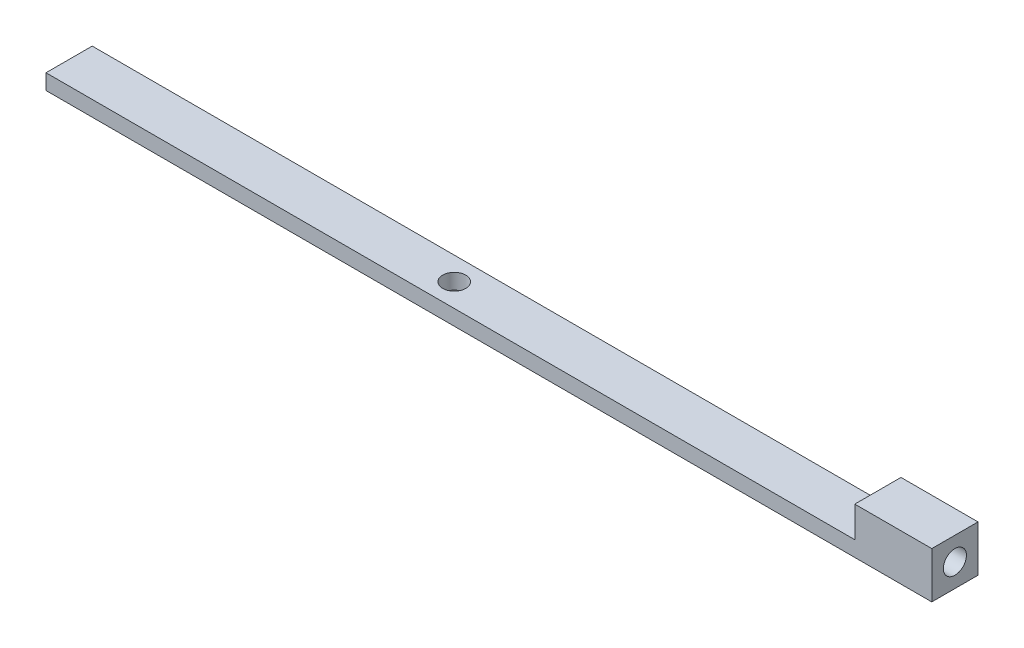
ISO-10303-21;
HEADER;
FILE_DESCRIPTION(('STEP AP214'),'2;1');
FILE_NAME('part.step','',(''),(''),'','','');
FILE_SCHEMA(('AUTOMOTIVE_DESIGN { 1 0 10303 214 1 1 1 1 }'));
ENDSEC;
DATA;
#1=APPLICATION_CONTEXT('core data for automotive mechanical design processes');
#2=APPLICATION_PROTOCOL_DEFINITION('international standard','automotive_design',2000,#1);
#3=PRODUCT_CONTEXT('',#1,'mechanical');
#4=PRODUCT('Part','Part','',(#3));
#5=PRODUCT_RELATED_PRODUCT_CATEGORY('part','',(#4));
#6=PRODUCT_DEFINITION_FORMATION('','',#4);
#7=PRODUCT_DEFINITION_CONTEXT('part definition',#1,'design');
#8=PRODUCT_DEFINITION('design','',#6,#7);
#9=PRODUCT_DEFINITION_SHAPE('','',#8);
#10=(LENGTH_UNIT() NAMED_UNIT(*) SI_UNIT(.MILLI.,.METRE.));
#11=(NAMED_UNIT(*) PLANE_ANGLE_UNIT() SI_UNIT($,.RADIAN.));
#12=(NAMED_UNIT(*) SI_UNIT($,.STERADIAN.) SOLID_ANGLE_UNIT());
#13=UNCERTAINTY_MEASURE_WITH_UNIT(LENGTH_MEASURE(1.E-05),#10,'distance_accuracy_value','');
#14=(GEOMETRIC_REPRESENTATION_CONTEXT(3) GLOBAL_UNCERTAINTY_ASSIGNED_CONTEXT((#13)) GLOBAL_UNIT_ASSIGNED_CONTEXT((#10,
#11,#12)) REPRESENTATION_CONTEXT('',''));
#15=CARTESIAN_POINT('',(0.,0.,0.));
#16=DIRECTION('',(0.,0.,1.));
#17=DIRECTION('',(1.,0.,0.));
#18=AXIS2_PLACEMENT_3D('',#15,#16,#17);
#19=CARTESIAN_POINT('',(-62.5,4.,-3.));
#20=DIRECTION('',(0.,0.,1.));
#21=DIRECTION('',(1.,0.,0.));
#22=AXIS2_PLACEMENT_3D('',#19,#20,#21);
#23=PLANE('',#22);
#24=DIRECTION('',(0.,1.,0.));
#25=VECTOR('',#24,1.);
#26=CARTESIAN_POINT('',(-42.5,0.,-3.));
#27=LINE('',#26,#25);
#28=CARTESIAN_POINT('',(-42.5,0.,-3.));
#29=VERTEX_POINT('',#28);
#30=CARTESIAN_POINT('',(-42.5,2.,-3.));
#31=VERTEX_POINT('',#30);
#32=EDGE_CURVE('E112',#29,#31,#27,.T.);
#33=ORIENTED_EDGE('',*,*,#32,.T.);
#34=DIRECTION('',(-1.,0.,0.));
#35=VECTOR('',#34,1.);
#36=CARTESIAN_POINT('',(62.5,2.,-3.));
#37=LINE('',#36,#35);
#38=CARTESIAN_POINT('',(62.5,2.,-3.));
#39=VERTEX_POINT('',#38);
#40=EDGE_CURVE('E151',#39,#31,#37,.T.);
#41=ORIENTED_EDGE('',*,*,#40,.F.);
#42=DIRECTION('',(0.,1.,0.));
#43=VECTOR('',#42,1.);
#44=CARTESIAN_POINT('',(62.5,0.,-3.));
#45=LINE('',#44,#43);
#46=CARTESIAN_POINT('',(62.5,6.,-3.));
#47=VERTEX_POINT('',#46);
#48=EDGE_CURVE('E145',#39,#47,#45,.T.);
#49=ORIENTED_EDGE('',*,*,#48,.T.);
#50=DIRECTION('',(-1.,0.,0.));
#51=VECTOR('',#50,1.);
#52=CARTESIAN_POINT('',(72.5,6.,-3.));
#53=LINE('',#52,#51);
#54=CARTESIAN_POINT('',(72.5,6.,-3.));
#55=VERTEX_POINT('',#54);
#56=EDGE_CURVE('E131',#55,#47,#53,.T.);
#57=ORIENTED_EDGE('',*,*,#56,.F.);
#58=DIRECTION('',(0.,1.,0.));
#59=VECTOR('',#58,1.);
#60=CARTESIAN_POINT('',(72.5,0.,-3.));
#61=LINE('',#60,#59);
#62=CARTESIAN_POINT('',(72.5,0.,-3.));
#63=VERTEX_POINT('',#62);
#64=EDGE_CURVE('E154',#63,#55,#61,.T.);
#65=ORIENTED_EDGE('',*,*,#64,.F.);
#66=DIRECTION('',(-1.,0.,0.));
#67=VECTOR('',#66,1.);
#68=CARTESIAN_POINT('',(-62.5,0.,-3.));
#69=LINE('',#68,#67);
#70=EDGE_CURVE('E129',#63,#29,#69,.T.);
#71=ORIENTED_EDGE('',*,*,#70,.T.);
#72=EDGE_LOOP('',(#33,#41,#49,#57,#65,#71));
#73=FACE_BOUND('',#72,.T.);
#74=ADVANCED_FACE('F47',(#73),#23,.F.);
#75=CARTESIAN_POINT('',(-62.5,4.,3.));
#76=DIRECTION('',(0.,0.,-1.));
#77=DIRECTION('',(-1.,0.,0.));
#78=AXIS2_PLACEMENT_3D('',#75,#76,#77);
#79=PLANE('',#78);
#80=DIRECTION('',(0.,1.,0.));
#81=VECTOR('',#80,1.);
#82=CARTESIAN_POINT('',(-42.5,0.,3.));
#83=LINE('',#82,#81);
#84=CARTESIAN_POINT('',(-42.5,0.,3.));
#85=VERTEX_POINT('',#84);
#86=CARTESIAN_POINT('',(-42.5,2.,3.));
#87=VERTEX_POINT('',#86);
#88=EDGE_CURVE('E62',#85,#87,#83,.T.);
#89=ORIENTED_EDGE('',*,*,#88,.F.);
#90=DIRECTION('',(1.,0.,0.));
#91=VECTOR('',#90,1.);
#92=CARTESIAN_POINT('',(-62.5,0.,3.));
#93=LINE('',#92,#91);
#94=CARTESIAN_POINT('',(72.5,0.,3.));
#95=VERTEX_POINT('',#94);
#96=EDGE_CURVE('E55',#85,#95,#93,.T.);
#97=ORIENTED_EDGE('',*,*,#96,.T.);
#98=DIRECTION('',(0.,-1.,0.));
#99=VECTOR('',#98,1.);
#100=CARTESIAN_POINT('',(72.5,0.,3.));
#101=LINE('',#100,#99);
#102=CARTESIAN_POINT('',(72.5,6.,3.));
#103=VERTEX_POINT('',#102);
#104=EDGE_CURVE('E144',#103,#95,#101,.T.);
#105=ORIENTED_EDGE('',*,*,#104,.F.);
#106=DIRECTION('',(-1.,0.,0.));
#107=VECTOR('',#106,1.);
#108=CARTESIAN_POINT('',(72.5,6.,3.));
#109=LINE('',#108,#107);
#110=CARTESIAN_POINT('',(62.5,6.,3.));
#111=VERTEX_POINT('',#110);
#112=EDGE_CURVE('E71',#103,#111,#109,.T.);
#113=ORIENTED_EDGE('',*,*,#112,.T.);
#114=DIRECTION('',(0.,-1.,0.));
#115=VECTOR('',#114,1.);
#116=CARTESIAN_POINT('',(62.5,0.,3.));
#117=LINE('',#116,#115);
#118=CARTESIAN_POINT('',(62.5,2.,3.));
#119=VERTEX_POINT('',#118);
#120=EDGE_CURVE('E148',#111,#119,#117,.T.);
#121=ORIENTED_EDGE('',*,*,#120,.T.);
#122=DIRECTION('',(1.,0.,0.));
#123=VECTOR('',#122,1.);
#124=CARTESIAN_POINT('',(62.5,2.,3.));
#125=LINE('',#124,#123);
#126=EDGE_CURVE('E120',#87,#119,#125,.T.);
#127=ORIENTED_EDGE('',*,*,#126,.F.);
#128=EDGE_LOOP('',(#89,#97,#105,#113,#121,#127));
#129=FACE_BOUND('',#128,.T.);
#130=ADVANCED_FACE('F119',(#129),#79,.F.);
#131=CARTESIAN_POINT('',(0.,0.,0.));
#132=DIRECTION('',(0.,1.,0.));
#133=DIRECTION('',(0.,0.,1.));
#134=AXIS2_PLACEMENT_3D('',#131,#132,#133);
#135=PLANE('',#134);
#136=CARTESIAN_POINT('',(7.50000000000001,0.,0.));
#137=DIRECTION('',(0.,1.,0.));
#138=DIRECTION('',(0.,0.,1.));
#139=AXIS2_PLACEMENT_3D('',#136,#137,#138);
#140=CIRCLE('',#139,1.5);
#141=CARTESIAN_POINT('',(7.50000000000001,0.,1.5));
#142=VERTEX_POINT('',#141);
#143=EDGE_CURVE('E116',#142,#142,#140,.T.);
#144=ORIENTED_EDGE('',*,*,#143,.T.);
#145=EDGE_LOOP('',(#144));
#146=FACE_BOUND('',#145,.T.);
#147=DIRECTION('',(0.,0.,1.));
#148=VECTOR('',#147,1.);
#149=CARTESIAN_POINT('',(-42.5,0.,-3.));
#150=LINE('',#149,#148);
#151=EDGE_CURVE('E109',#29,#85,#150,.T.);
#152=ORIENTED_EDGE('',*,*,#151,.F.);
#153=ORIENTED_EDGE('',*,*,#70,.F.);
#154=DIRECTION('',(0.,0.,-1.));
#155=VECTOR('',#154,1.);
#156=CARTESIAN_POINT('',(72.5,0.,0.));
#157=LINE('',#156,#155);
#158=EDGE_CURVE('E126',#95,#63,#157,.T.);
#159=ORIENTED_EDGE('',*,*,#158,.F.);
#160=ORIENTED_EDGE('',*,*,#96,.F.);
#161=EDGE_LOOP('',(#152,#153,#159,#160));
#162=FACE_BOUND('',#161,.T.);
#163=ADVANCED_FACE('F124',(#146,#162),#135,.F.);
#164=CARTESIAN_POINT('',(0.,2.,0.));
#165=DIRECTION('',(0.,-1.,0.));
#166=DIRECTION('',(0.,0.,-1.));
#167=AXIS2_PLACEMENT_3D('',#164,#165,#166);
#168=PLANE('',#167);
#169=CARTESIAN_POINT('',(7.50000000000001,2.,0.));
#170=DIRECTION('',(0.,1.,0.));
#171=DIRECTION('',(0.,0.,1.));
#172=AXIS2_PLACEMENT_3D('',#169,#170,#171);
#173=CIRCLE('',#172,1.5);
#174=CARTESIAN_POINT('',(7.50000000000001,2.,1.5));
#175=VERTEX_POINT('',#174);
#176=EDGE_CURVE('E184',#175,#175,#173,.T.);
#177=ORIENTED_EDGE('',*,*,#176,.F.);
#178=EDGE_LOOP('',(#177));
#179=FACE_BOUND('',#178,.T.);
#180=DIRECTION('',(0.,0.,1.));
#181=VECTOR('',#180,1.);
#182=CARTESIAN_POINT('',(-42.5,2.,-3.));
#183=LINE('',#182,#181);
#184=EDGE_CURVE('E122',#31,#87,#183,.T.);
#185=ORIENTED_EDGE('',*,*,#184,.T.);
#186=ORIENTED_EDGE('',*,*,#126,.T.);
#187=DIRECTION('',(0.,0.,-1.));
#188=VECTOR('',#187,1.);
#189=CARTESIAN_POINT('',(62.5,2.,-3.));
#190=LINE('',#189,#188);
#191=CARTESIAN_POINT('',(62.5,2.,1.11803398874989));
#192=VERTEX_POINT('',#191);
#193=EDGE_CURVE('E164',#119,#192,#190,.T.);
#194=ORIENTED_EDGE('',*,*,#193,.T.);
#195=DIRECTION('',(0.,0.,-1.));
#196=VECTOR('',#195,1.);
#197=CARTESIAN_POINT('',(62.5,2.,0.));
#198=LINE('',#197,#196);
#199=CARTESIAN_POINT('',(62.5,2.,-1.11803398874989));
#200=VERTEX_POINT('',#199);
#201=EDGE_CURVE('E11',#192,#200,#198,.T.);
#202=ORIENTED_EDGE('',*,*,#201,.T.);
#203=EDGE_CURVE('E168',#200,#39,#190,.T.);
#204=ORIENTED_EDGE('',*,*,#203,.T.);
#205=ORIENTED_EDGE('',*,*,#40,.T.);
#206=EDGE_LOOP('',(#185,#186,#194,#202,#204,#205));
#207=FACE_BOUND('',#206,.T.);
#208=ADVANCED_FACE('F199',(#179,#207),#168,.F.);
#209=CARTESIAN_POINT('',(72.5,6.,0.));
#210=DIRECTION('',(0.,1.,0.));
#211=DIRECTION('',(0.,0.,1.));
#212=AXIS2_PLACEMENT_3D('',#209,#210,#211);
#213=PLANE('',#212);
#214=DIRECTION('',(0.,0.,-1.));
#215=VECTOR('',#214,1.);
#216=CARTESIAN_POINT('',(62.5,6.,0.));
#217=LINE('',#216,#215);
#218=EDGE_CURVE('E140',#111,#47,#217,.T.);
#219=ORIENTED_EDGE('',*,*,#218,.F.);
#220=ORIENTED_EDGE('',*,*,#112,.F.);
#221=DIRECTION('',(0.,0.,-1.));
#222=VECTOR('',#221,1.);
#223=CARTESIAN_POINT('',(72.5,6.,0.));
#224=LINE('',#223,#222);
#225=EDGE_CURVE('E139',#103,#55,#224,.T.);
#226=ORIENTED_EDGE('',*,*,#225,.T.);
#227=ORIENTED_EDGE('',*,*,#56,.T.);
#228=EDGE_LOOP('',(#219,#220,#226,#227));
#229=FACE_BOUND('',#228,.T.);
#230=ADVANCED_FACE('F202',(#229),#213,.T.);
#231=CARTESIAN_POINT('',(72.5,0.,0.));
#232=DIRECTION('',(1.,0.,0.));
#233=DIRECTION('',(0.,0.,-1.));
#234=AXIS2_PLACEMENT_3D('',#231,#232,#233);
#235=PLANE('',#234);
#236=CARTESIAN_POINT('',(72.5,3.,0.));
#237=DIRECTION('',(1.,0.,0.));
#238=DIRECTION('',(0.,0.,-1.));
#239=AXIS2_PLACEMENT_3D('',#236,#237,#238);
#240=CIRCLE('',#239,1.5);
#241=CARTESIAN_POINT('',(72.5,3.,-1.5));
#242=VERTEX_POINT('',#241);
#243=EDGE_CURVE('E172',#242,#242,#240,.T.);
#244=ORIENTED_EDGE('',*,*,#243,.F.);
#245=EDGE_LOOP('',(#244));
#246=FACE_BOUND('',#245,.T.);
#247=ORIENTED_EDGE('',*,*,#104,.T.);
#248=ORIENTED_EDGE('',*,*,#158,.T.);
#249=ORIENTED_EDGE('',*,*,#64,.T.);
#250=ORIENTED_EDGE('',*,*,#225,.F.);
#251=EDGE_LOOP('',(#247,#248,#249,#250));
#252=FACE_BOUND('',#251,.T.);
#253=ADVANCED_FACE('F209',(#246,#252),#235,.T.);
#254=CARTESIAN_POINT('',(62.5,0.,0.));
#255=DIRECTION('',(1.,0.,0.));
#256=DIRECTION('',(0.,0.,-1.));
#257=AXIS2_PLACEMENT_3D('',#254,#255,#256);
#258=PLANE('',#257);
#259=ORIENTED_EDGE('',*,*,#203,.F.);
#260=CARTESIAN_POINT('',(62.5,3.,0.));
#261=DIRECTION('',(1.,0.,0.));
#262=DIRECTION('',(0.,0.,-1.));
#263=AXIS2_PLACEMENT_3D('',#260,#261,#262);
#264=CIRCLE('',#263,1.5);
#265=EDGE_CURVE('E176',#200,#192,#264,.T.);
#266=ORIENTED_EDGE('',*,*,#265,.T.);
#267=ORIENTED_EDGE('',*,*,#193,.F.);
#268=ORIENTED_EDGE('',*,*,#120,.F.);
#269=ORIENTED_EDGE('',*,*,#218,.T.);
#270=ORIENTED_EDGE('',*,*,#48,.F.);
#271=EDGE_LOOP('',(#259,#266,#267,#268,#269,#270));
#272=FACE_BOUND('',#271,.T.);
#273=ADVANCED_FACE('F214',(#272),#258,.F.);
#274=CARTESIAN_POINT('',(62.5,3.,0.));
#275=DIRECTION('',(1.,0.,0.));
#276=DIRECTION('',(0.,0.,-1.));
#277=AXIS2_PLACEMENT_3D('',#274,#275,#276);
#278=PLANE('',#277);
#279=ORIENTED_EDGE('',*,*,#201,.F.);
#280=EDGE_CURVE('E171',#192,#200,#264,.T.);
#281=ORIENTED_EDGE('',*,*,#280,.T.);
#282=EDGE_LOOP('',(#279,#281));
#283=FACE_BOUND('',#282,.T.);
#284=ADVANCED_FACE('F224',(#283),#278,.T.);
#285=CARTESIAN_POINT('',(62.5,3.,0.));
#286=DIRECTION('',(1.,0.,0.));
#287=DIRECTION('',(0.,0.,-1.));
#288=AXIS2_PLACEMENT_3D('',#285,#286,#287);
#289=CYLINDRICAL_SURFACE('',#288,1.5);
#290=ORIENTED_EDGE('',*,*,#280,.F.);
#291=ORIENTED_EDGE('',*,*,#265,.F.);
#292=EDGE_LOOP('',(#290,#291));
#293=FACE_BOUND('',#292,.T.);
#294=ORIENTED_EDGE('',*,*,#243,.T.);
#295=EDGE_LOOP('',(#294));
#296=FACE_BOUND('',#295,.T.);
#297=ADVANCED_FACE('F221',(#293,#296),#289,.F.);
#298=CARTESIAN_POINT('',(-42.5,0.,0.));
#299=DIRECTION('',(-1.,0.,0.));
#300=DIRECTION('',(0.,0.,1.));
#301=AXIS2_PLACEMENT_3D('',#298,#299,#300);
#302=PLANE('',#301);
#303=ORIENTED_EDGE('',*,*,#151,.T.);
#304=ORIENTED_EDGE('',*,*,#88,.T.);
#305=ORIENTED_EDGE('',*,*,#184,.F.);
#306=ORIENTED_EDGE('',*,*,#32,.F.);
#307=EDGE_LOOP('',(#303,#304,#305,#306));
#308=FACE_BOUND('',#307,.T.);
#309=ADVANCED_FACE('F110',(#308),#302,.T.);
#310=CARTESIAN_POINT('',(7.50000000000001,0.,0.));
#311=DIRECTION('',(0.,1.,0.));
#312=DIRECTION('',(0.,0.,1.));
#313=AXIS2_PLACEMENT_3D('',#310,#311,#312);
#314=CYLINDRICAL_SURFACE('',#313,1.5);
#315=ORIENTED_EDGE('',*,*,#143,.F.);
#316=EDGE_LOOP('',(#315));
#317=FACE_BOUND('',#316,.T.);
#318=ORIENTED_EDGE('',*,*,#176,.T.);
#319=EDGE_LOOP('',(#318));
#320=FACE_BOUND('',#319,.T.);
#321=ADVANCED_FACE('F193',(#317,#320),#314,.F.);
#322=CLOSED_SHELL('',(#74,#130,#163,#208,#230,#253,#273,#284,#297,#309,#321));
#323=MANIFOLD_SOLID_BREP('B2',#322);
#324=ADVANCED_BREP_SHAPE_REPRESENTATION('',(#18,#323),#14);
#325=SHAPE_DEFINITION_REPRESENTATION(#9,#324);
ENDSEC;
END-ISO-10303-21;
